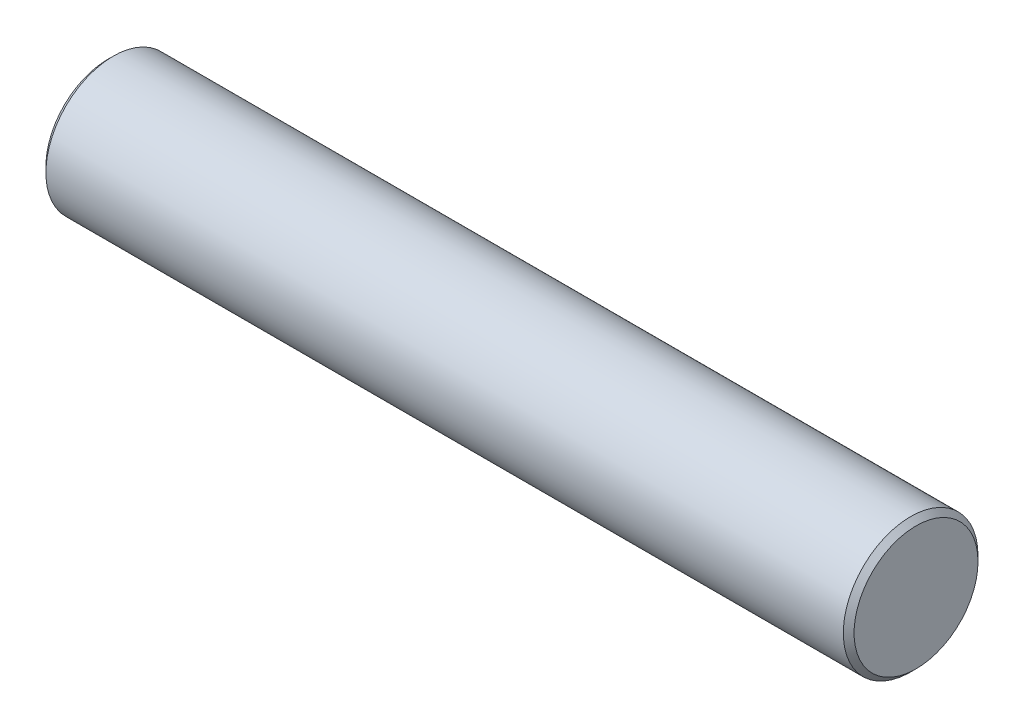
ISO-10303-21;
HEADER;
FILE_DESCRIPTION(('STEP AP214'),'2;1');
FILE_NAME('part.step','',(''),(''),'','','');
FILE_SCHEMA(('AUTOMOTIVE_DESIGN { 1 0 10303 214 1 1 1 1 }'));
ENDSEC;
DATA;
#1=APPLICATION_CONTEXT('core data for automotive mechanical design processes');
#2=APPLICATION_PROTOCOL_DEFINITION('international standard','automotive_design',2000,#1);
#3=PRODUCT_CONTEXT('',#1,'mechanical');
#4=PRODUCT('Part','Part','',(#3));
#5=PRODUCT_RELATED_PRODUCT_CATEGORY('part','',(#4));
#6=PRODUCT_DEFINITION_FORMATION('','',#4);
#7=PRODUCT_DEFINITION_CONTEXT('part definition',#1,'design');
#8=PRODUCT_DEFINITION('design','',#6,#7);
#9=PRODUCT_DEFINITION_SHAPE('','',#8);
#10=(LENGTH_UNIT() NAMED_UNIT(*) SI_UNIT(.MILLI.,.METRE.));
#11=(NAMED_UNIT(*) PLANE_ANGLE_UNIT() SI_UNIT($,.RADIAN.));
#12=(NAMED_UNIT(*) SI_UNIT($,.STERADIAN.) SOLID_ANGLE_UNIT());
#13=UNCERTAINTY_MEASURE_WITH_UNIT(LENGTH_MEASURE(1.E-05),#10,'distance_accuracy_value','');
#14=(GEOMETRIC_REPRESENTATION_CONTEXT(3) GLOBAL_UNCERTAINTY_ASSIGNED_CONTEXT((#13)) GLOBAL_UNIT_ASSIGNED_CONTEXT((#10,
#11,#12)) REPRESENTATION_CONTEXT('',''));
#15=CARTESIAN_POINT('',(0.,0.,0.));
#16=DIRECTION('',(0.,0.,1.));
#17=DIRECTION('',(1.,0.,0.));
#18=AXIS2_PLACEMENT_3D('',#15,#16,#17);
#19=CARTESIAN_POINT('',(0.,0.,0.));
#20=DIRECTION('',(1.,0.,0.));
#21=DIRECTION('',(0.,0.,-1.));
#22=AXIS2_PLACEMENT_3D('',#19,#20,#21);
#23=PLANE('',#22);
#24=CARTESIAN_POINT('',(0.,0.,0.));
#25=DIRECTION('',(1.,0.,0.));
#26=DIRECTION('',(0.,0.,-1.));
#27=AXIS2_PLACEMENT_3D('',#24,#25,#26);
#28=CIRCLE('',#27,2.3);
#29=CARTESIAN_POINT('',(0.,0.,-2.3));
#30=VERTEX_POINT('',#29);
#31=EDGE_CURVE('E10',#30,#30,#28,.T.);
#32=ORIENTED_EDGE('',*,*,#31,.T.);
#33=EDGE_LOOP('',(#32));
#34=FACE_BOUND('',#33,.T.);
#35=ADVANCED_FACE('F41',(#34),#23,.T.);
#36=CARTESIAN_POINT('',(0.,0.,0.));
#37=DIRECTION('',(1.,0.,0.));
#38=DIRECTION('',(0.,0.,-1.));
#39=AXIS2_PLACEMENT_3D('',#36,#37,#38);
#40=CYLINDRICAL_SURFACE('',#39,2.5);
#41=CARTESIAN_POINT('',(-29.8,0.,0.));
#42=DIRECTION('',(-1.,0.,0.));
#43=DIRECTION('',(0.,0.,1.));
#44=AXIS2_PLACEMENT_3D('',#41,#42,#43);
#45=CIRCLE('',#44,2.5);
#46=CARTESIAN_POINT('',(-29.8,0.,-2.5));
#47=VERTEX_POINT('',#46);
#48=EDGE_CURVE('E53',#47,#47,#45,.F.);
#49=ORIENTED_EDGE('',*,*,#48,.T.);
#50=EDGE_LOOP('',(#49));
#51=FACE_BOUND('',#50,.T.);
#52=CARTESIAN_POINT('',(-0.200000000000001,0.,0.));
#53=DIRECTION('',(1.,0.,0.));
#54=DIRECTION('',(0.,0.,-1.));
#55=AXIS2_PLACEMENT_3D('',#52,#53,#54);
#56=CIRCLE('',#55,2.5);
#57=CARTESIAN_POINT('',(-0.200000000000001,0.,-2.5));
#58=VERTEX_POINT('',#57);
#59=EDGE_CURVE('E57',#58,#58,#56,.F.);
#60=ORIENTED_EDGE('',*,*,#59,.T.);
#61=EDGE_LOOP('',(#60));
#62=FACE_BOUND('',#61,.T.);
#63=ADVANCED_FACE('F63',(#51,#62),#40,.T.);
#64=CARTESIAN_POINT('',(-30.,0.,0.));
#65=DIRECTION('',(-1.,0.,0.));
#66=DIRECTION('',(0.,0.,1.));
#67=AXIS2_PLACEMENT_3D('',#64,#65,#66);
#68=PLANE('',#67);
#69=CARTESIAN_POINT('',(-30.,0.,0.));
#70=DIRECTION('',(-1.,0.,0.));
#71=DIRECTION('',(0.,0.,1.));
#72=AXIS2_PLACEMENT_3D('',#69,#70,#71);
#73=CIRCLE('',#72,2.30000000000001);
#74=CARTESIAN_POINT('',(-30.,0.,-2.30000000000001));
#75=VERTEX_POINT('',#74);
#76=EDGE_CURVE('E49',#75,#75,#73,.T.);
#77=ORIENTED_EDGE('',*,*,#76,.T.);
#78=EDGE_LOOP('',(#77));
#79=FACE_BOUND('',#78,.T.);
#80=ADVANCED_FACE('F71',(#79),#68,.T.);
#81=CARTESIAN_POINT('',(-29.8,0.,0.));
#82=DIRECTION('',(1.,0.,0.));
#83=DIRECTION('',(0.,0.,-1.));
#84=AXIS2_PLACEMENT_3D('',#81,#82,#83);
#85=CONICAL_SURFACE('',#84,2.5,0.785398163397447);
#86=CARTESIAN_POINT('',(-30.,0.,-2.30000000000001));
#87=CARTESIAN_POINT('',(-29.9979166666667,0.,-2.30208333333335));
#88=CARTESIAN_POINT('',(-29.9958333333333,0.,-2.30416666666668));
#89=CARTESIAN_POINT('',(-29.9916666666667,0.,-2.30833333333335));
#90=CARTESIAN_POINT('',(-29.9895833333333,0.,-2.31041666666668));
#91=CARTESIAN_POINT('',(-29.9854166666667,0.,-2.31458333333334));
#92=CARTESIAN_POINT('',(-29.9833333333333,0.,-2.31666666666668));
#93=CARTESIAN_POINT('',(-29.9791666666667,0.,-2.32083333333334));
#94=CARTESIAN_POINT('',(-29.9770833333333,0.,-2.32291666666668));
#95=CARTESIAN_POINT('',(-29.9729166666667,0.,-2.32708333333334));
#96=CARTESIAN_POINT('',(-29.9708333333333,0.,-2.32916666666668));
#97=CARTESIAN_POINT('',(-29.9666666666667,0.,-2.33333333333334));
#98=CARTESIAN_POINT('',(-29.9645833333333,0.,-2.33541666666668));
#99=CARTESIAN_POINT('',(-29.9604166666667,0.,-2.33958333333334));
#100=CARTESIAN_POINT('',(-29.9583333333333,0.,-2.34166666666668));
#101=CARTESIAN_POINT('',(-29.9541666666667,0.,-2.34583333333334));
#102=CARTESIAN_POINT('',(-29.9520833333333,0.,-2.34791666666668));
#103=CARTESIAN_POINT('',(-29.9479166666667,0.,-2.35208333333334));
#104=CARTESIAN_POINT('',(-29.9458333333333,0.,-2.35416666666668));
#105=CARTESIAN_POINT('',(-29.9416666666667,0.,-2.35833333333334));
#106=CARTESIAN_POINT('',(-29.9395833333333,0.,-2.36041666666668));
#107=CARTESIAN_POINT('',(-29.9354166666667,0.,-2.36458333333334));
#108=CARTESIAN_POINT('',(-29.9333333333333,0.,-2.36666666666667));
#109=CARTESIAN_POINT('',(-29.9291666666667,0.,-2.37083333333334));
#110=CARTESIAN_POINT('',(-29.9270833333333,0.,-2.37291666666667));
#111=CARTESIAN_POINT('',(-29.9229166666667,0.,-2.37708333333334));
#112=CARTESIAN_POINT('',(-29.9208333333333,0.,-2.37916666666667));
#113=CARTESIAN_POINT('',(-29.9166666666667,0.,-2.38333333333334));
#114=CARTESIAN_POINT('',(-29.9145833333333,0.,-2.38541666666667));
#115=CARTESIAN_POINT('',(-29.9104166666667,0.,-2.38958333333334));
#116=CARTESIAN_POINT('',(-29.9083333333333,0.,-2.39166666666667));
#117=CARTESIAN_POINT('',(-29.9041666666667,0.,-2.39583333333334));
#118=CARTESIAN_POINT('',(-29.9020833333333,0.,-2.39791666666667));
#119=CARTESIAN_POINT('',(-29.8979166666667,0.,-2.40208333333334));
#120=CARTESIAN_POINT('',(-29.8958333333333,0.,-2.40416666666667));
#121=CARTESIAN_POINT('',(-29.8916666666667,0.,-2.40833333333334));
#122=CARTESIAN_POINT('',(-29.8895833333333,0.,-2.41041666666667));
#123=CARTESIAN_POINT('',(-29.8854166666667,0.,-2.41458333333334));
#124=CARTESIAN_POINT('',(-29.8833333333333,0.,-2.41666666666667));
#125=CARTESIAN_POINT('',(-29.8791666666667,0.,-2.42083333333334));
#126=CARTESIAN_POINT('',(-29.8770833333333,0.,-2.42291666666667));
#127=CARTESIAN_POINT('',(-29.8729166666667,0.,-2.42708333333334));
#128=CARTESIAN_POINT('',(-29.8708333333333,0.,-2.42916666666667));
#129=CARTESIAN_POINT('',(-29.8666666666667,0.,-2.43333333333334));
#130=CARTESIAN_POINT('',(-29.8645833333333,0.,-2.43541666666667));
#131=CARTESIAN_POINT('',(-29.8604166666667,0.,-2.43958333333334));
#132=CARTESIAN_POINT('',(-29.8583333333333,0.,-2.44166666666667));
#133=CARTESIAN_POINT('',(-29.8541666666667,0.,-2.44583333333334));
#134=CARTESIAN_POINT('',(-29.8520833333333,0.,-2.44791666666667));
#135=CARTESIAN_POINT('',(-29.8479166666667,0.,-2.45208333333334));
#136=CARTESIAN_POINT('',(-29.8458333333333,0.,-2.45416666666667));
#137=CARTESIAN_POINT('',(-29.8416666666667,0.,-2.45833333333334));
#138=CARTESIAN_POINT('',(-29.8395833333333,0.,-2.46041666666667));
#139=CARTESIAN_POINT('',(-29.8354166666667,0.,-2.46458333333334));
#140=CARTESIAN_POINT('',(-29.8333333333333,0.,-2.46666666666667));
#141=CARTESIAN_POINT('',(-29.8291666666667,0.,-2.47083333333333));
#142=CARTESIAN_POINT('',(-29.8270833333333,0.,-2.47291666666667));
#143=CARTESIAN_POINT('',(-29.8229166666667,0.,-2.47708333333333));
#144=CARTESIAN_POINT('',(-29.8208333333333,0.,-2.47916666666667));
#145=CARTESIAN_POINT('',(-29.8166666666667,0.,-2.48333333333333));
#146=CARTESIAN_POINT('',(-29.8145833333333,0.,-2.48541666666667));
#147=CARTESIAN_POINT('',(-29.8104166666667,0.,-2.48958333333333));
#148=CARTESIAN_POINT('',(-29.8083333333333,0.,-2.49166666666667));
#149=CARTESIAN_POINT('',(-29.8041666666667,0.,-2.49583333333333));
#150=CARTESIAN_POINT('',(-29.8020833333333,0.,-2.49791666666667));
#151=CARTESIAN_POINT('',(-29.8,0.,-2.5));
#152=B_SPLINE_CURVE_WITH_KNOTS('',3,(#86,#87,#88,#89,#90,#91,#92,#93,#94,#95,#96,#97,#98,#99,
#100,#101,#102,#103,#104,#105,#106,#107,#108,#109,#110,#111,#112,#113,#114,#115,#116,#117,#118,
#119,#120,#121,#122,#123,#124,#125,#126,#127,#128,#129,#130,#131,#132,#133,#134,#135,#136,#137,
#138,#139,#140,#141,#142,#143,#144,#145,#146,#147,#148,#149,#150,#151),.UNSPECIFIED.,.F.,.F.,(4,
2,2,2,2,2,2,2,2,2,2,2,2,2,2,2,2,2,2,2,2,2,2,2,2,2,2,2,2,2,2,2,4),(0.,0.00883883476483118,
0.017677669529662,0.0265165042944932,0.0353553390593244,0.0441941738241556,0.0530330085889864,
0.0618718433538176,0.0707106781186488,0.0795495128834797,0.0883883476483109,0.0972271824131445,
0.106066017177976,0.114904851942807,0.123743686707638,0.132582521472469,0.1414213562373,
0.150260191002131,0.159099025766962,0.167937860531793,0.176776695296624,0.185615530061455,
0.194454364826289,0.20329319959112,0.212132034355951,0.220970869120782,0.229809703885613,
0.238648538650444,0.247487373415275,0.256326208180107,0.265165042944938,0.274003877709769,
0.2828427124746),.UNSPECIFIED.);
#153=EDGE_CURVE('BSEAM67',#75,#47,#152,.T.);
#154=ORIENTED_EDGE('',*,*,#76,.F.);
#155=ORIENTED_EDGE('',*,*,#48,.F.);
#156=ORIENTED_EDGE('',*,*,#153,.T.);
#157=ORIENTED_EDGE('',*,*,#153,.F.);
#158=EDGE_LOOP('',(#154,#156,#155,#157));
#159=FACE_BOUND('',#158,.T.);
#160=ADVANCED_FACE('F67',(#159),#85,.T.);
#161=CARTESIAN_POINT('',(0.,0.,0.));
#162=DIRECTION('',(-1.,0.,0.));
#163=DIRECTION('',(0.,0.,1.));
#164=AXIS2_PLACEMENT_3D('',#161,#162,#163);
#165=CONICAL_SURFACE('',#164,2.3,0.785398163397441);
#166=ORIENTED_EDGE('',*,*,#59,.F.);
#167=EDGE_LOOP('',(#166));
#168=FACE_BOUND('',#167,.T.);
#169=ORIENTED_EDGE('',*,*,#31,.F.);
#170=EDGE_LOOP('',(#169));
#171=FACE_BOUND('',#170,.T.);
#172=ADVANCED_FACE('F44',(#168,#171),#165,.T.);
#173=CLOSED_SHELL('',(#35,#63,#80,#160,#172));
#174=MANIFOLD_SOLID_BREP('B2',#173);
#175=ADVANCED_BREP_SHAPE_REPRESENTATION('',(#18,#174),#14);
#176=SHAPE_DEFINITION_REPRESENTATION(#9,#175);
ENDSEC;
END-ISO-10303-21;
